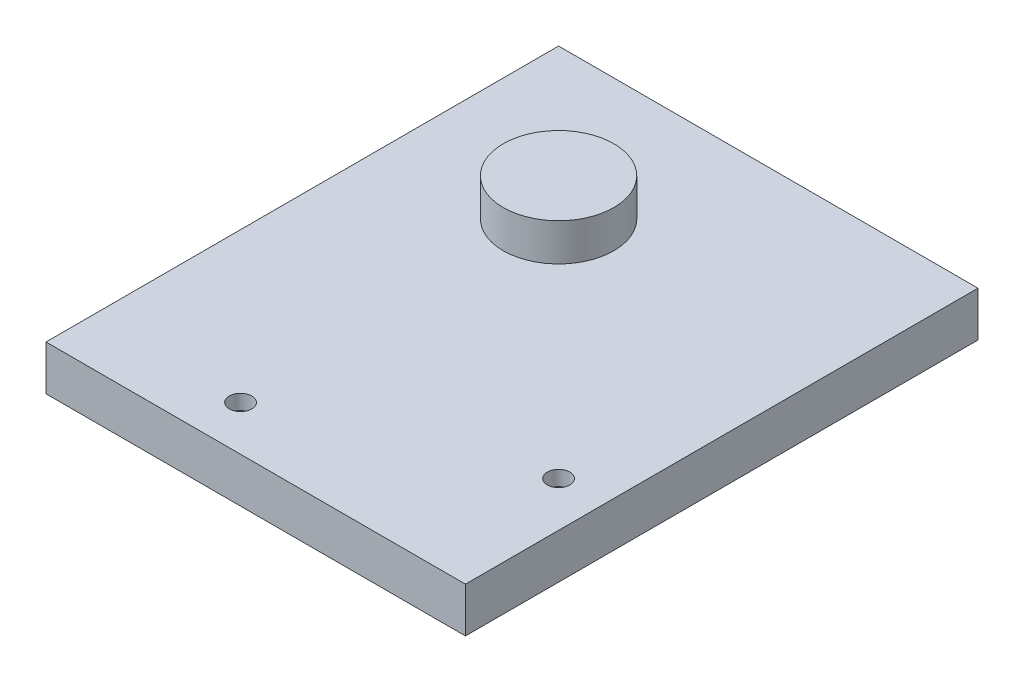
ISO-10303-21;
HEADER;
FILE_DESCRIPTION(('STEP AP214'),'2;1');
FILE_NAME('part.step','',(''),(''),'','','');
FILE_SCHEMA(('AUTOMOTIVE_DESIGN { 1 0 10303 214 1 1 1 1 }'));
ENDSEC;
DATA;
#1=APPLICATION_CONTEXT('core data for automotive mechanical design processes');
#2=APPLICATION_PROTOCOL_DEFINITION('international standard','automotive_design',2000,#1);
#3=PRODUCT_CONTEXT('',#1,'mechanical');
#4=PRODUCT('Part','Part','',(#3));
#5=PRODUCT_RELATED_PRODUCT_CATEGORY('part','',(#4));
#6=PRODUCT_DEFINITION_FORMATION('','',#4);
#7=PRODUCT_DEFINITION_CONTEXT('part definition',#1,'design');
#8=PRODUCT_DEFINITION('design','',#6,#7);
#9=PRODUCT_DEFINITION_SHAPE('','',#8);
#10=(LENGTH_UNIT() NAMED_UNIT(*) SI_UNIT(.MILLI.,.METRE.));
#11=(NAMED_UNIT(*) PLANE_ANGLE_UNIT() SI_UNIT($,.RADIAN.));
#12=(NAMED_UNIT(*) SI_UNIT($,.STERADIAN.) SOLID_ANGLE_UNIT());
#13=UNCERTAINTY_MEASURE_WITH_UNIT(LENGTH_MEASURE(1.E-05),#10,'distance_accuracy_value','');
#14=(GEOMETRIC_REPRESENTATION_CONTEXT(3) GLOBAL_UNCERTAINTY_ASSIGNED_CONTEXT((#13)) GLOBAL_UNIT_ASSIGNED_CONTEXT((#10,
#11,#12)) REPRESENTATION_CONTEXT('',''));
#15=CARTESIAN_POINT('',(0.,0.,0.));
#16=DIRECTION('',(0.,0.,1.));
#17=DIRECTION('',(1.,0.,0.));
#18=AXIS2_PLACEMENT_3D('',#15,#16,#17);
#19=CARTESIAN_POINT('',(0.,-6.,42.5));
#20=DIRECTION('',(0.,1.,0.));
#21=DIRECTION('',(0.,0.,1.));
#22=AXIS2_PLACEMENT_3D('',#19,#20,#21);
#23=CYLINDRICAL_SURFACE('',#22,1.5);
#24=CARTESIAN_POINT('',(0.,0.,42.5));
#25=DIRECTION('',(0.,1.,0.));
#26=DIRECTION('',(0.,0.,1.));
#27=AXIS2_PLACEMENT_3D('',#24,#25,#26);
#28=CIRCLE('',#27,1.5);
#29=CARTESIAN_POINT('',(0.,0.,44.));
#30=VERTEX_POINT('',#29);
#31=EDGE_CURVE('E117',#30,#30,#28,.T.);
#32=ORIENTED_EDGE('',*,*,#31,.T.);
#33=EDGE_LOOP('',(#32));
#34=FACE_BOUND('',#33,.T.);
#35=CARTESIAN_POINT('',(0.,-2.,42.5));
#36=DIRECTION('',(0.,-1.,0.));
#37=DIRECTION('',(0.,0.,-1.));
#38=AXIS2_PLACEMENT_3D('',#35,#36,#37);
#39=CIRCLE('',#38,1.5);
#40=CARTESIAN_POINT('',(0.,-2.,41.));
#41=VERTEX_POINT('',#40);
#42=EDGE_CURVE('E200',#41,#41,#39,.F.);
#43=ORIENTED_EDGE('',*,*,#42,.F.);
#44=EDGE_LOOP('',(#43));
#45=FACE_BOUND('',#44,.T.);
#46=ADVANCED_FACE('F45',(#34,#45),#23,.F.);
#47=CARTESIAN_POINT('',(30.0520382004281,-6.,30.0520382004284));
#48=DIRECTION('',(0.,1.,0.));
#49=DIRECTION('',(0.,0.,1.));
#50=AXIS2_PLACEMENT_3D('',#47,#48,#49);
#51=CYLINDRICAL_SURFACE('',#50,1.5);
#52=CARTESIAN_POINT('',(30.0520382004281,0.,30.0520382004284));
#53=DIRECTION('',(0.,1.,0.));
#54=DIRECTION('',(0.,0.,1.));
#55=AXIS2_PLACEMENT_3D('',#52,#53,#54);
#56=CIRCLE('',#55,1.5);
#57=CARTESIAN_POINT('',(30.0520382004281,0.,31.5520382004284));
#58=VERTEX_POINT('',#57);
#59=EDGE_CURVE('E113',#58,#58,#56,.T.);
#60=ORIENTED_EDGE('',*,*,#59,.T.);
#61=EDGE_LOOP('',(#60));
#62=FACE_BOUND('',#61,.T.);
#63=CARTESIAN_POINT('',(30.0520382004281,-2.,30.0520382004284));
#64=DIRECTION('',(0.,-1.,0.));
#65=DIRECTION('',(0.,0.,-1.));
#66=AXIS2_PLACEMENT_3D('',#63,#64,#65);
#67=CIRCLE('',#66,1.5);
#68=CARTESIAN_POINT('',(30.0520382004281,-2.,28.5520382004284));
#69=VERTEX_POINT('',#68);
#70=EDGE_CURVE('E218',#69,#69,#67,.F.);
#71=ORIENTED_EDGE('',*,*,#70,.F.);
#72=EDGE_LOOP('',(#71));
#73=FACE_BOUND('',#72,.T.);
#74=ADVANCED_FACE('F47',(#62,#73),#51,.F.);
#75=CARTESIAN_POINT('',(36.0520382004281,-6.,0.));
#76=DIRECTION('',(-1.,0.,0.));
#77=DIRECTION('',(0.,0.,1.));
#78=AXIS2_PLACEMENT_3D('',#75,#76,#77);
#79=PLANE('',#78);
#80=DIRECTION('',(0.,0.,1.));
#81=VECTOR('',#80,1.);
#82=CARTESIAN_POINT('',(36.0520382004281,0.,0.));
#83=LINE('',#82,#81);
#84=CARTESIAN_POINT('',(36.0520382004281,0.,-20.));
#85=VERTEX_POINT('',#84);
#86=CARTESIAN_POINT('',(36.0520382004281,0.,48.5));
#87=VERTEX_POINT('',#86);
#88=EDGE_CURVE('E122',#85,#87,#83,.T.);
#89=ORIENTED_EDGE('',*,*,#88,.T.);
#90=DIRECTION('',(0.,1.,0.));
#91=VECTOR('',#90,1.);
#92=CARTESIAN_POINT('',(36.0520382004281,-6.,48.5));
#93=LINE('',#92,#91);
#94=CARTESIAN_POINT('',(36.0520382004281,-6.,48.5));
#95=VERTEX_POINT('',#94);
#96=EDGE_CURVE('E11',#95,#87,#93,.T.);
#97=ORIENTED_EDGE('',*,*,#96,.F.);
#98=DIRECTION('',(0.,0.,1.));
#99=VECTOR('',#98,1.);
#100=CARTESIAN_POINT('',(36.0520382004281,-6.,0.));
#101=LINE('',#100,#99);
#102=CARTESIAN_POINT('',(36.0520382004281,-6.,-20.));
#103=VERTEX_POINT('',#102);
#104=EDGE_CURVE('E65',#103,#95,#101,.T.);
#105=ORIENTED_EDGE('',*,*,#104,.F.);
#106=DIRECTION('',(0.,1.,0.));
#107=VECTOR('',#106,1.);
#108=CARTESIAN_POINT('',(36.0520382004281,-6.,-20.));
#109=LINE('',#108,#107);
#110=EDGE_CURVE('E49',#103,#85,#109,.T.);
#111=ORIENTED_EDGE('',*,*,#110,.T.);
#112=EDGE_LOOP('',(#89,#97,#105,#111));
#113=FACE_BOUND('',#112,.T.);
#114=ADVANCED_FACE('F138',(#113),#79,.F.);
#115=CARTESIAN_POINT('',(0.,-6.,48.5));
#116=DIRECTION('',(0.,0.,1.));
#117=DIRECTION('',(1.,0.,0.));
#118=AXIS2_PLACEMENT_3D('',#115,#116,#117);
#119=PLANE('',#118);
#120=DIRECTION('',(1.,0.,0.));
#121=VECTOR('',#120,1.);
#122=CARTESIAN_POINT('',(0.,0.,48.5));
#123=LINE('',#122,#121);
#124=CARTESIAN_POINT('',(-20.,0.,48.5));
#125=VERTEX_POINT('',#124);
#126=EDGE_CURVE('E130',#125,#87,#123,.T.);
#127=ORIENTED_EDGE('',*,*,#126,.F.);
#128=DIRECTION('',(0.,1.,0.));
#129=VECTOR('',#128,1.);
#130=CARTESIAN_POINT('',(-20.,-6.,48.5));
#131=LINE('',#130,#129);
#132=CARTESIAN_POINT('',(-20.,-6.,48.5));
#133=VERTEX_POINT('',#132);
#134=EDGE_CURVE('E56',#133,#125,#131,.T.);
#135=ORIENTED_EDGE('',*,*,#134,.F.);
#136=DIRECTION('',(1.,0.,0.));
#137=VECTOR('',#136,1.);
#138=CARTESIAN_POINT('',(0.,-6.,48.5));
#139=LINE('',#138,#137);
#140=EDGE_CURVE('E106',#133,#95,#139,.T.);
#141=ORIENTED_EDGE('',*,*,#140,.T.);
#142=ORIENTED_EDGE('',*,*,#96,.T.);
#143=EDGE_LOOP('',(#127,#135,#141,#142));
#144=FACE_BOUND('',#143,.T.);
#145=ADVANCED_FACE('F141',(#144),#119,.T.);
#146=CARTESIAN_POINT('',(-20.,-6.,0.));
#147=DIRECTION('',(-1.,0.,0.));
#148=DIRECTION('',(0.,0.,1.));
#149=AXIS2_PLACEMENT_3D('',#146,#147,#148);
#150=PLANE('',#149);
#151=DIRECTION('',(0.,0.,1.));
#152=VECTOR('',#151,1.);
#153=CARTESIAN_POINT('',(-20.,0.,0.));
#154=LINE('',#153,#152);
#155=CARTESIAN_POINT('',(-20.,0.,-20.));
#156=VERTEX_POINT('',#155);
#157=EDGE_CURVE('E97',#156,#125,#154,.T.);
#158=ORIENTED_EDGE('',*,*,#157,.F.);
#159=DIRECTION('',(0.,1.,0.));
#160=VECTOR('',#159,1.);
#161=CARTESIAN_POINT('',(-20.,-6.,-20.));
#162=LINE('',#161,#160);
#163=CARTESIAN_POINT('',(-20.,-6.,-20.));
#164=VERTEX_POINT('',#163);
#165=EDGE_CURVE('E94',#164,#156,#162,.T.);
#166=ORIENTED_EDGE('',*,*,#165,.F.);
#167=DIRECTION('',(0.,0.,1.));
#168=VECTOR('',#167,1.);
#169=CARTESIAN_POINT('',(-20.,-6.,0.));
#170=LINE('',#169,#168);
#171=EDGE_CURVE('E96',#164,#133,#170,.T.);
#172=ORIENTED_EDGE('',*,*,#171,.T.);
#173=ORIENTED_EDGE('',*,*,#134,.T.);
#174=EDGE_LOOP('',(#158,#166,#172,#173));
#175=FACE_BOUND('',#174,.T.);
#176=ADVANCED_FACE('F95',(#175),#150,.T.);
#177=CARTESIAN_POINT('',(0.,-6.,-20.));
#178=DIRECTION('',(0.,0.,1.));
#179=DIRECTION('',(1.,0.,0.));
#180=AXIS2_PLACEMENT_3D('',#177,#178,#179);
#181=PLANE('',#180);
#182=DIRECTION('',(1.,0.,0.));
#183=VECTOR('',#182,1.);
#184=CARTESIAN_POINT('',(0.,0.,-20.));
#185=LINE('',#184,#183);
#186=EDGE_CURVE('E125',#156,#85,#185,.T.);
#187=ORIENTED_EDGE('',*,*,#186,.T.);
#188=ORIENTED_EDGE('',*,*,#110,.F.);
#189=DIRECTION('',(1.,0.,0.));
#190=VECTOR('',#189,1.);
#191=CARTESIAN_POINT('',(0.,-6.,-20.));
#192=LINE('',#191,#190);
#193=EDGE_CURVE('E91',#164,#103,#192,.T.);
#194=ORIENTED_EDGE('',*,*,#193,.F.);
#195=ORIENTED_EDGE('',*,*,#165,.T.);
#196=EDGE_LOOP('',(#187,#188,#194,#195));
#197=FACE_BOUND('',#196,.T.);
#198=ADVANCED_FACE('F101',(#197),#181,.F.);
#199=CARTESIAN_POINT('',(0.,-6.,0.));
#200=DIRECTION('',(0.,1.,0.));
#201=DIRECTION('',(0.,0.,1.));
#202=AXIS2_PLACEMENT_3D('',#199,#200,#201);
#203=PLANE('',#202);
#204=CARTESIAN_POINT('',(0.,-6.,42.5));
#205=DIRECTION('',(0.,-1.,0.));
#206=DIRECTION('',(0.,0.,-1.));
#207=AXIS2_PLACEMENT_3D('',#204,#205,#206);
#208=CIRCLE('',#207,1.95);
#209=CARTESIAN_POINT('',(0.,-6.,40.55));
#210=VERTEX_POINT('',#209);
#211=EDGE_CURVE('E211',#210,#210,#208,.T.);
#212=ORIENTED_EDGE('',*,*,#211,.F.);
#213=EDGE_LOOP('',(#212));
#214=FACE_BOUND('',#213,.T.);
#215=CARTESIAN_POINT('',(30.0520382004281,-6.,30.0520382004284));
#216=DIRECTION('',(0.,-1.,0.));
#217=DIRECTION('',(0.,0.,-1.));
#218=AXIS2_PLACEMENT_3D('',#215,#216,#217);
#219=CIRCLE('',#218,1.95);
#220=CARTESIAN_POINT('',(30.0520382004281,-6.,28.1020382004284));
#221=VERTEX_POINT('',#220);
#222=EDGE_CURVE('E222',#221,#221,#219,.T.);
#223=ORIENTED_EDGE('',*,*,#222,.F.);
#224=EDGE_LOOP('',(#223));
#225=FACE_BOUND('',#224,.T.);
#226=ORIENTED_EDGE('',*,*,#104,.T.);
#227=ORIENTED_EDGE('',*,*,#140,.F.);
#228=ORIENTED_EDGE('',*,*,#171,.F.);
#229=ORIENTED_EDGE('',*,*,#193,.T.);
#230=EDGE_LOOP('',(#226,#227,#228,#229));
#231=FACE_BOUND('',#230,.T.);
#232=ADVANCED_FACE('F105',(#214,#225,#231),#203,.F.);
#233=CARTESIAN_POINT('',(0.,0.,0.));
#234=DIRECTION('',(0.,1.,0.));
#235=DIRECTION('',(0.,0.,1.));
#236=AXIS2_PLACEMENT_3D('',#233,#234,#235);
#237=PLANE('',#236);
#238=CARTESIAN_POINT('',(0.,0.,0.));
#239=DIRECTION('',(0.,1.,0.));
#240=DIRECTION('',(0.,0.,1.));
#241=AXIS2_PLACEMENT_3D('',#238,#239,#240);
#242=CIRCLE('',#241,7.39);
#243=CARTESIAN_POINT('',(0.,0.,7.39));
#244=VERTEX_POINT('',#243);
#245=EDGE_CURVE('E205',#244,#244,#242,.T.);
#246=ORIENTED_EDGE('',*,*,#245,.F.);
#247=EDGE_LOOP('',(#246));
#248=FACE_BOUND('',#247,.T.);
#249=ORIENTED_EDGE('',*,*,#59,.F.);
#250=EDGE_LOOP('',(#249));
#251=FACE_BOUND('',#250,.T.);
#252=ORIENTED_EDGE('',*,*,#31,.F.);
#253=EDGE_LOOP('',(#252));
#254=FACE_BOUND('',#253,.T.);
#255=ORIENTED_EDGE('',*,*,#88,.F.);
#256=ORIENTED_EDGE('',*,*,#186,.F.);
#257=ORIENTED_EDGE('',*,*,#157,.T.);
#258=ORIENTED_EDGE('',*,*,#126,.T.);
#259=EDGE_LOOP('',(#255,#256,#257,#258));
#260=FACE_BOUND('',#259,.T.);
#261=ADVANCED_FACE('F140',(#248,#251,#254,#260),#237,.T.);
#262=CARTESIAN_POINT('',(0.,5.,0.));
#263=DIRECTION('',(0.,-1.,0.));
#264=DIRECTION('',(0.,0.,-1.));
#265=AXIS2_PLACEMENT_3D('',#262,#263,#264);
#266=CYLINDRICAL_SURFACE('',#265,7.39);
#267=CARTESIAN_POINT('',(0.,5.,0.));
#268=DIRECTION('',(0.,1.,0.));
#269=DIRECTION('',(0.,0.,1.));
#270=AXIS2_PLACEMENT_3D('',#267,#268,#269);
#271=CIRCLE('',#270,7.39);
#272=CARTESIAN_POINT('',(0.,5.,7.39));
#273=VERTEX_POINT('',#272);
#274=EDGE_CURVE('E118',#273,#273,#271,.T.);
#275=ORIENTED_EDGE('',*,*,#274,.F.);
#276=EDGE_LOOP('',(#275));
#277=FACE_BOUND('',#276,.T.);
#278=ORIENTED_EDGE('',*,*,#245,.T.);
#279=EDGE_LOOP('',(#278));
#280=FACE_BOUND('',#279,.T.);
#281=ADVANCED_FACE('F170',(#277,#280),#266,.T.);
#282=CARTESIAN_POINT('',(0.,5.,0.));
#283=DIRECTION('',(0.,1.,0.));
#284=DIRECTION('',(0.,0.,1.));
#285=AXIS2_PLACEMENT_3D('',#282,#283,#284);
#286=PLANE('',#285);
#287=ORIENTED_EDGE('',*,*,#274,.T.);
#288=EDGE_LOOP('',(#287));
#289=FACE_BOUND('',#288,.T.);
#290=ADVANCED_FACE('F177',(#289),#286,.T.);
#291=CARTESIAN_POINT('',(30.0520382004281,-2.,30.0520382004284));
#292=DIRECTION('',(0.,-1.,0.));
#293=DIRECTION('',(0.,0.,-1.));
#294=AXIS2_PLACEMENT_3D('',#291,#292,#293);
#295=CYLINDRICAL_SURFACE('',#294,1.95);
#296=CARTESIAN_POINT('',(30.0520382004281,-2.,30.0520382004284));
#297=DIRECTION('',(0.,-1.,0.));
#298=DIRECTION('',(0.,0.,-1.));
#299=AXIS2_PLACEMENT_3D('',#296,#297,#298);
#300=CIRCLE('',#299,1.95);
#301=CARTESIAN_POINT('',(30.0520382004281,-2.,28.1020382004284));
#302=VERTEX_POINT('',#301);
#303=EDGE_CURVE('E217',#302,#302,#300,.T.);
#304=ORIENTED_EDGE('',*,*,#303,.F.);
#305=EDGE_LOOP('',(#304));
#306=FACE_BOUND('',#305,.T.);
#307=ORIENTED_EDGE('',*,*,#222,.T.);
#308=EDGE_LOOP('',(#307));
#309=FACE_BOUND('',#308,.T.);
#310=ADVANCED_FACE('F180',(#306,#309),#295,.F.);
#311=CARTESIAN_POINT('',(0.,-2.,0.));
#312=DIRECTION('',(0.,-1.,0.));
#313=DIRECTION('',(0.,0.,-1.));
#314=AXIS2_PLACEMENT_3D('',#311,#312,#313);
#315=PLANE('',#314);
#316=ORIENTED_EDGE('',*,*,#70,.T.);
#317=EDGE_LOOP('',(#316));
#318=FACE_BOUND('',#317,.T.);
#319=ORIENTED_EDGE('',*,*,#303,.T.);
#320=EDGE_LOOP('',(#319));
#321=FACE_BOUND('',#320,.T.);
#322=ADVANCED_FACE('F183',(#318,#321),#315,.T.);
#323=CARTESIAN_POINT('',(0.,-2.,42.5));
#324=DIRECTION('',(0.,-1.,0.));
#325=DIRECTION('',(0.,0.,-1.));
#326=AXIS2_PLACEMENT_3D('',#323,#324,#325);
#327=CYLINDRICAL_SURFACE('',#326,1.95);
#328=CARTESIAN_POINT('',(0.,-2.,42.5));
#329=DIRECTION('',(0.,-1.,0.));
#330=DIRECTION('',(0.,0.,-1.));
#331=AXIS2_PLACEMENT_3D('',#328,#329,#330);
#332=CIRCLE('',#331,1.95);
#333=CARTESIAN_POINT('',(0.,-2.,40.55));
#334=VERTEX_POINT('',#333);
#335=EDGE_CURVE('E203',#334,#334,#332,.T.);
#336=ORIENTED_EDGE('',*,*,#335,.F.);
#337=EDGE_LOOP('',(#336));
#338=FACE_BOUND('',#337,.T.);
#339=ORIENTED_EDGE('',*,*,#211,.T.);
#340=EDGE_LOOP('',(#339));
#341=FACE_BOUND('',#340,.T.);
#342=ADVANCED_FACE('F187',(#338,#341),#327,.F.);
#343=CARTESIAN_POINT('',(0.,-2.,0.));
#344=DIRECTION('',(0.,-1.,0.));
#345=DIRECTION('',(0.,0.,-1.));
#346=AXIS2_PLACEMENT_3D('',#343,#344,#345);
#347=PLANE('',#346);
#348=ORIENTED_EDGE('',*,*,#42,.T.);
#349=EDGE_LOOP('',(#348));
#350=FACE_BOUND('',#349,.T.);
#351=ORIENTED_EDGE('',*,*,#335,.T.);
#352=EDGE_LOOP('',(#351));
#353=FACE_BOUND('',#352,.T.);
#354=ADVANCED_FACE('F191',(#350,#353),#347,.T.);
#355=CLOSED_SHELL('',(#46,#74,#114,#145,#176,#198,#232,#261,#281,#290,#310,#322,#342,#354));
#356=MANIFOLD_SOLID_BREP('B2',#355);
#357=ADVANCED_BREP_SHAPE_REPRESENTATION('',(#18,#356),#14);
#358=SHAPE_DEFINITION_REPRESENTATION(#9,#357);
ENDSEC;
END-ISO-10303-21;
